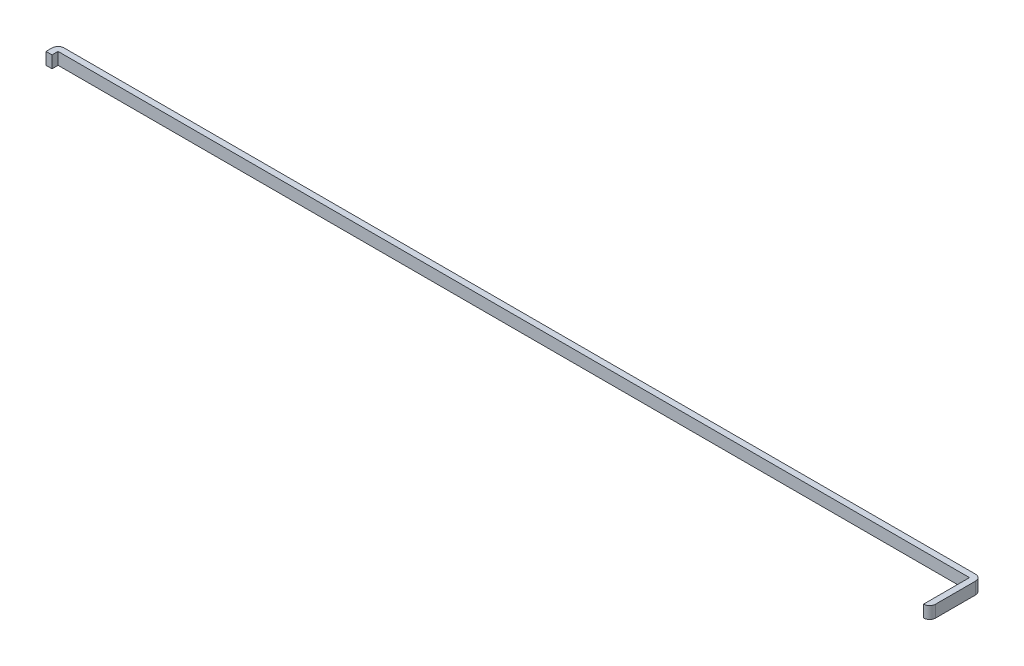
ISO-10303-21;
HEADER;
FILE_DESCRIPTION(('STEP AP214'),'2;1');
FILE_NAME('part.step','',(''),(''),'','','');
FILE_SCHEMA(('AUTOMOTIVE_DESIGN { 1 0 10303 214 1 1 1 1 }'));
ENDSEC;
DATA;
#1=APPLICATION_CONTEXT('core data for automotive mechanical design processes');
#2=APPLICATION_PROTOCOL_DEFINITION('international standard','automotive_design',2000,#1);
#3=PRODUCT_CONTEXT('',#1,'mechanical');
#4=PRODUCT('Part','Part','',(#3));
#5=PRODUCT_RELATED_PRODUCT_CATEGORY('part','',(#4));
#6=PRODUCT_DEFINITION_FORMATION('','',#4);
#7=PRODUCT_DEFINITION_CONTEXT('part definition',#1,'design');
#8=PRODUCT_DEFINITION('design','',#6,#7);
#9=PRODUCT_DEFINITION_SHAPE('','',#8);
#10=(LENGTH_UNIT() NAMED_UNIT(*) SI_UNIT(.MILLI.,.METRE.));
#11=(NAMED_UNIT(*) PLANE_ANGLE_UNIT() SI_UNIT($,.RADIAN.));
#12=(NAMED_UNIT(*) SI_UNIT($,.STERADIAN.) SOLID_ANGLE_UNIT());
#13=UNCERTAINTY_MEASURE_WITH_UNIT(LENGTH_MEASURE(1.E-05),#10,'distance_accuracy_value','');
#14=(GEOMETRIC_REPRESENTATION_CONTEXT(3) GLOBAL_UNCERTAINTY_ASSIGNED_CONTEXT((#13)) GLOBAL_UNIT_ASSIGNED_CONTEXT((#10,
#11,#12)) REPRESENTATION_CONTEXT('',''));
#15=CARTESIAN_POINT('',(0.,0.,0.));
#16=DIRECTION('',(0.,0.,1.));
#17=DIRECTION('',(1.,0.,0.));
#18=AXIS2_PLACEMENT_3D('',#15,#16,#17);
#19=CARTESIAN_POINT('',(-15.113,-2.60619,0.20019));
#20=DIRECTION('',(0.,0.,-1.));
#21=DIRECTION('',(-1.,0.,0.));
#22=AXIS2_PLACEMENT_3D('',#19,#20,#21);
#23=PLANE('',#22);
#24=DIRECTION('',(0.,1.,0.));
#25=VECTOR('',#24,1.);
#26=CARTESIAN_POINT('',(15.123,-2.60619,0.20019));
#27=LINE('',#26,#25);
#28=CARTESIAN_POINT('',(15.123,-2.60619,0.20019));
#29=VERTEX_POINT('',#28);
#30=CARTESIAN_POINT('',(15.123,-2.20581,0.20019));
#31=VERTEX_POINT('',#30);
#32=EDGE_CURVE('E125',#29,#31,#27,.T.);
#33=ORIENTED_EDGE('',*,*,#32,.T.);
#34=DIRECTION('',(1.,0.,0.));
#35=VECTOR('',#34,1.);
#36=CARTESIAN_POINT('',(15.123,-2.20581,0.20019));
#37=LINE('',#36,#35);
#38=CARTESIAN_POINT('',(-15.113,-2.20581,0.20019));
#39=VERTEX_POINT('',#38);
#40=EDGE_CURVE('E112',#31,#39,#37,.F.);
#41=ORIENTED_EDGE('',*,*,#40,.T.);
#42=DIRECTION('',(0.,1.,0.));
#43=VECTOR('',#42,1.);
#44=CARTESIAN_POINT('',(-15.113,-2.60619,0.20019));
#45=LINE('',#44,#43);
#46=CARTESIAN_POINT('',(-15.113,-2.60619,0.20019));
#47=VERTEX_POINT('',#46);
#48=EDGE_CURVE('E108',#39,#47,#45,.F.);
#49=ORIENTED_EDGE('',*,*,#48,.T.);
#50=DIRECTION('',(1.,0.,0.));
#51=VECTOR('',#50,1.);
#52=CARTESIAN_POINT('',(15.123,-2.60619,0.20019));
#53=LINE('',#52,#51);
#54=EDGE_CURVE('E126',#29,#47,#53,.F.);
#55=ORIENTED_EDGE('',*,*,#54,.F.);
#56=EDGE_LOOP('',(#33,#41,#49,#55));
#57=FACE_BOUND('',#56,.T.);
#58=ADVANCED_FACE('F17',(#57),#23,.F.);
#59=CARTESIAN_POINT('',(-15.113,-2.60619,0.40038));
#60=DIRECTION('',(-1.,0.,0.));
#61=DIRECTION('',(0.,0.,1.));
#62=AXIS2_PLACEMENT_3D('',#59,#60,#61);
#63=PLANE('',#62);
#64=ORIENTED_EDGE('',*,*,#48,.F.);
#65=DIRECTION('',(0.,0.,-1.));
#66=VECTOR('',#65,1.);
#67=CARTESIAN_POINT('',(-15.113,-2.20581,0.20019));
#68=LINE('',#67,#66);
#69=CARTESIAN_POINT('',(-15.113,-2.20581,0.40038));
#70=VERTEX_POINT('',#69);
#71=EDGE_CURVE('E120',#39,#70,#68,.F.);
#72=ORIENTED_EDGE('',*,*,#71,.T.);
#73=DIRECTION('',(0.,1.,0.));
#74=VECTOR('',#73,1.);
#75=CARTESIAN_POINT('',(-15.113,-2.60619,0.40038));
#76=LINE('',#75,#74);
#77=CARTESIAN_POINT('',(-15.113,-2.60619,0.40038));
#78=VERTEX_POINT('',#77);
#79=EDGE_CURVE('E177',#70,#78,#76,.F.);
#80=ORIENTED_EDGE('',*,*,#79,.T.);
#81=DIRECTION('',(0.,0.,-1.));
#82=VECTOR('',#81,1.);
#83=CARTESIAN_POINT('',(-15.113,-2.60619,0.20019));
#84=LINE('',#83,#82);
#85=EDGE_CURVE('E168',#47,#78,#84,.F.);
#86=ORIENTED_EDGE('',*,*,#85,.F.);
#87=EDGE_LOOP('',(#64,#72,#80,#86));
#88=FACE_BOUND('',#87,.T.);
#89=ADVANCED_FACE('F227',(#88),#63,.F.);
#90=CARTESIAN_POINT('',(-15.31319,-2.60619,0.40038));
#91=DIRECTION('',(0.,0.,-1.));
#92=DIRECTION('',(-1.,0.,0.));
#93=AXIS2_PLACEMENT_3D('',#90,#91,#92);
#94=PLANE('',#93);
#95=ORIENTED_EDGE('',*,*,#79,.F.);
#96=DIRECTION('',(1.,0.,0.));
#97=VECTOR('',#96,1.);
#98=CARTESIAN_POINT('',(15.123,-2.20581,0.40038));
#99=LINE('',#98,#97);
#100=CARTESIAN_POINT('',(-15.31319,-2.20581,0.40038));
#101=VERTEX_POINT('',#100);
#102=EDGE_CURVE('E145',#70,#101,#99,.F.);
#103=ORIENTED_EDGE('',*,*,#102,.T.);
#104=DIRECTION('',(0.,1.,0.));
#105=VECTOR('',#104,1.);
#106=CARTESIAN_POINT('',(-15.31319,-2.60619,0.40038));
#107=LINE('',#106,#105);
#108=CARTESIAN_POINT('',(-15.31319,-2.60619,0.40038));
#109=VERTEX_POINT('',#108);
#110=EDGE_CURVE('E184',#101,#109,#107,.F.);
#111=ORIENTED_EDGE('',*,*,#110,.T.);
#112=DIRECTION('',(1.,0.,0.));
#113=VECTOR('',#112,1.);
#114=CARTESIAN_POINT('',(15.123,-2.60619,0.40038));
#115=LINE('',#114,#113);
#116=EDGE_CURVE('E86',#78,#109,#115,.F.);
#117=ORIENTED_EDGE('',*,*,#116,.F.);
#118=EDGE_LOOP('',(#95,#103,#111,#117));
#119=FACE_BOUND('',#118,.T.);
#120=ADVANCED_FACE('F226',(#119),#94,.F.);
#121=CARTESIAN_POINT('',(-15.31319,-2.60619,0.20019));
#122=DIRECTION('',(1.,0.,0.));
#123=DIRECTION('',(0.,0.,-1.));
#124=AXIS2_PLACEMENT_3D('',#121,#122,#123);
#125=PLANE('',#124);
#126=ORIENTED_EDGE('',*,*,#110,.F.);
#127=DIRECTION('',(0.,0.,-1.));
#128=VECTOR('',#127,1.);
#129=CARTESIAN_POINT('',(-15.31319,-2.20581,0.20019));
#130=LINE('',#129,#128);
#131=CARTESIAN_POINT('',(-15.31319,-2.20581,0.20019));
#132=VERTEX_POINT('',#131);
#133=EDGE_CURVE('E148',#101,#132,#130,.T.);
#134=ORIENTED_EDGE('',*,*,#133,.T.);
#135=DIRECTION('',(0.,-1.,0.));
#136=VECTOR('',#135,1.);
#137=CARTESIAN_POINT('',(-15.31319,-2.60619,0.20019));
#138=LINE('',#137,#136);
#139=CARTESIAN_POINT('',(-15.31319,-2.60619,0.20019));
#140=VERTEX_POINT('',#139);
#141=EDGE_CURVE('E134',#140,#132,#138,.F.);
#142=ORIENTED_EDGE('',*,*,#141,.F.);
#143=DIRECTION('',(0.,0.,-1.));
#144=VECTOR('',#143,1.);
#145=CARTESIAN_POINT('',(-15.31319,-2.60619,0.20019));
#146=LINE('',#145,#144);
#147=EDGE_CURVE('E80',#109,#140,#146,.T.);
#148=ORIENTED_EDGE('',*,*,#147,.F.);
#149=EDGE_LOOP('',(#126,#134,#142,#148));
#150=FACE_BOUND('',#149,.T.);
#151=ADVANCED_FACE('F224',(#150),#125,.F.);
#152=CARTESIAN_POINT('',(15.32319,-2.60619,1.524905));
#153=DIRECTION('',(-1.,0.,0.));
#154=DIRECTION('',(0.,0.,1.));
#155=AXIS2_PLACEMENT_3D('',#152,#153,#154);
#156=PLANE('',#155);
#157=DIRECTION('',(0.,-1.,0.));
#158=VECTOR('',#157,1.);
#159=CARTESIAN_POINT('',(15.32319,-2.60619,0.20019));
#160=LINE('',#159,#158);
#161=CARTESIAN_POINT('',(15.32319,-2.20581,0.20019));
#162=VERTEX_POINT('',#161);
#163=CARTESIAN_POINT('',(15.32319,-2.60619,0.20019));
#164=VERTEX_POINT('',#163);
#165=EDGE_CURVE('E74',#162,#164,#160,.T.);
#166=ORIENTED_EDGE('',*,*,#165,.F.);
#167=DIRECTION('',(0.,0.,-1.));
#168=VECTOR('',#167,1.);
#169=CARTESIAN_POINT('',(15.32319,-2.20581,0.20019));
#170=LINE('',#169,#168);
#171=CARTESIAN_POINT('',(15.32319,-2.20581,1.524905));
#172=VERTEX_POINT('',#171);
#173=EDGE_CURVE('E139',#162,#172,#170,.F.);
#174=ORIENTED_EDGE('',*,*,#173,.T.);
#175=DIRECTION('',(0.,-1.,0.));
#176=VECTOR('',#175,1.);
#177=CARTESIAN_POINT('',(15.32319,-2.60619,1.524905));
#178=LINE('',#177,#176);
#179=CARTESIAN_POINT('',(15.32319,-2.60619,1.524905));
#180=VERTEX_POINT('',#179);
#181=EDGE_CURVE('E190',#180,#172,#178,.F.);
#182=ORIENTED_EDGE('',*,*,#181,.F.);
#183=DIRECTION('',(0.,0.,-1.));
#184=VECTOR('',#183,1.);
#185=CARTESIAN_POINT('',(15.32319,-2.60619,0.20019));
#186=LINE('',#185,#184);
#187=EDGE_CURVE('E160',#164,#180,#186,.F.);
#188=ORIENTED_EDGE('',*,*,#187,.F.);
#189=EDGE_LOOP('',(#166,#174,#182,#188));
#190=FACE_BOUND('',#189,.T.);
#191=ADVANCED_FACE('F216',(#190),#156,.F.);
#192=CARTESIAN_POINT('',(15.123,-2.60619,1.524905));
#193=DIRECTION('',(0.,-1.,0.));
#194=DIRECTION('',(0.,0.,-1.));
#195=AXIS2_PLACEMENT_3D('',#192,#193,#194);
#196=CYLINDRICAL_SURFACE('',#195,0.20019);
#197=CARTESIAN_POINT('',(15.123,-2.20581,1.524905));
#198=DIRECTION('',(0.,-1.,0.));
#199=DIRECTION('',(0.,0.,-1.));
#200=AXIS2_PLACEMENT_3D('',#197,#198,#199);
#201=CIRCLE('',#200,0.20019);
#202=CARTESIAN_POINT('',(15.123,-2.20581,1.725095));
#203=VERTEX_POINT('',#202);
#204=EDGE_CURVE('E135',#172,#203,#201,.T.);
#205=ORIENTED_EDGE('',*,*,#204,.T.);
#206=DIRECTION('',(0.,1.,0.));
#207=VECTOR('',#206,1.);
#208=CARTESIAN_POINT('',(15.123,-2.60619,1.725095));
#209=LINE('',#208,#207);
#210=CARTESIAN_POINT('',(15.123,-2.60619,1.725095));
#211=VERTEX_POINT('',#210);
#212=EDGE_CURVE('E129',#203,#211,#209,.F.);
#213=ORIENTED_EDGE('',*,*,#212,.T.);
#214=CARTESIAN_POINT('',(15.123,-2.60619,1.524905));
#215=DIRECTION('',(0.,-1.,0.));
#216=DIRECTION('',(0.,0.,-1.));
#217=AXIS2_PLACEMENT_3D('',#214,#215,#216);
#218=CIRCLE('',#217,0.20019);
#219=EDGE_CURVE('E156',#180,#211,#218,.T.);
#220=ORIENTED_EDGE('',*,*,#219,.F.);
#221=ORIENTED_EDGE('',*,*,#181,.T.);
#222=EDGE_LOOP('',(#205,#213,#220,#221));
#223=FACE_BOUND('',#222,.T.);
#224=ADVANCED_FACE('F218',(#223),#196,.T.);
#225=CARTESIAN_POINT('',(15.123,-2.60619,0.20019));
#226=DIRECTION('',(1.,0.,0.));
#227=DIRECTION('',(0.,0.,-1.));
#228=AXIS2_PLACEMENT_3D('',#225,#226,#227);
#229=PLANE('',#228);
#230=DIRECTION('',(0.,0.,-1.));
#231=VECTOR('',#230,1.);
#232=CARTESIAN_POINT('',(15.123,-2.60619,0.20019));
#233=LINE('',#232,#231);
#234=EDGE_CURVE('E159',#211,#29,#233,.T.);
#235=ORIENTED_EDGE('',*,*,#234,.F.);
#236=ORIENTED_EDGE('',*,*,#212,.F.);
#237=DIRECTION('',(0.,0.,-1.));
#238=VECTOR('',#237,1.);
#239=CARTESIAN_POINT('',(15.123,-2.20581,0.20019));
#240=LINE('',#239,#238);
#241=EDGE_CURVE('E117',#203,#31,#240,.T.);
#242=ORIENTED_EDGE('',*,*,#241,.T.);
#243=ORIENTED_EDGE('',*,*,#32,.F.);
#244=EDGE_LOOP('',(#235,#236,#242,#243));
#245=FACE_BOUND('',#244,.T.);
#246=ADVANCED_FACE('F131',(#245),#229,.F.);
#247=CARTESIAN_POINT('',(15.123,-2.60619,0.20019));
#248=DIRECTION('',(0.,-1.,0.));
#249=DIRECTION('',(0.,0.,-1.));
#250=AXIS2_PLACEMENT_3D('',#247,#248,#249);
#251=CYLINDRICAL_SURFACE('',#250,0.20019);
#252=CARTESIAN_POINT('',(15.123,-2.20581,0.20019));
#253=DIRECTION('',(0.,-1.,0.));
#254=DIRECTION('',(0.,0.,-1.));
#255=AXIS2_PLACEMENT_3D('',#252,#253,#254);
#256=CIRCLE('',#255,0.20019);
#257=CARTESIAN_POINT('',(15.123,-2.20581,0.));
#258=VERTEX_POINT('',#257);
#259=EDGE_CURVE('E20',#258,#162,#256,.T.);
#260=ORIENTED_EDGE('',*,*,#259,.T.);
#261=ORIENTED_EDGE('',*,*,#165,.T.);
#262=CARTESIAN_POINT('',(15.123,-2.60619,0.20019));
#263=DIRECTION('',(0.,-1.,0.));
#264=DIRECTION('',(0.,0.,-1.));
#265=AXIS2_PLACEMENT_3D('',#262,#263,#264);
#266=CIRCLE('',#265,0.20019);
#267=CARTESIAN_POINT('',(15.123,-2.60619,0.));
#268=VERTEX_POINT('',#267);
#269=EDGE_CURVE('E161',#268,#164,#266,.T.);
#270=ORIENTED_EDGE('',*,*,#269,.F.);
#271=DIRECTION('',(0.,1.,0.));
#272=VECTOR('',#271,1.);
#273=CARTESIAN_POINT('',(15.123,-2.60619,0.));
#274=LINE('',#273,#272);
#275=EDGE_CURVE('E64',#268,#258,#274,.T.);
#276=ORIENTED_EDGE('',*,*,#275,.T.);
#277=EDGE_LOOP('',(#260,#261,#270,#276));
#278=FACE_BOUND('',#277,.T.);
#279=ADVANCED_FACE('F219',(#278),#251,.T.);
#280=CARTESIAN_POINT('',(15.123,-2.20581,0.20019));
#281=DIRECTION('',(0.,-1.,0.));
#282=DIRECTION('',(0.,0.,-1.));
#283=AXIS2_PLACEMENT_3D('',#280,#281,#282);
#284=PLANE('',#283);
#285=ORIENTED_EDGE('',*,*,#241,.F.);
#286=ORIENTED_EDGE('',*,*,#204,.F.);
#287=ORIENTED_EDGE('',*,*,#173,.F.);
#288=ORIENTED_EDGE('',*,*,#259,.F.);
#289=DIRECTION('',(1.,0.,0.));
#290=VECTOR('',#289,1.);
#291=CARTESIAN_POINT('',(15.123,-2.20581,0.));
#292=LINE('',#291,#290);
#293=CARTESIAN_POINT('',(-15.113,-2.20581,0.));
#294=VERTEX_POINT('',#293);
#295=EDGE_CURVE('E204',#258,#294,#292,.F.);
#296=ORIENTED_EDGE('',*,*,#295,.T.);
#297=CARTESIAN_POINT('',(-15.113,-2.20581,0.20019));
#298=DIRECTION('',(0.,-1.,0.));
#299=DIRECTION('',(0.,0.,-1.));
#300=AXIS2_PLACEMENT_3D('',#297,#298,#299);
#301=CIRCLE('',#300,0.20019);
#302=EDGE_CURVE('E137',#132,#294,#301,.T.);
#303=ORIENTED_EDGE('',*,*,#302,.F.);
#304=ORIENTED_EDGE('',*,*,#133,.F.);
#305=ORIENTED_EDGE('',*,*,#102,.F.);
#306=ORIENTED_EDGE('',*,*,#71,.F.);
#307=ORIENTED_EDGE('',*,*,#40,.F.);
#308=EDGE_LOOP('',(#285,#286,#287,#288,#296,#303,#304,#305,#306,#307));
#309=FACE_BOUND('',#308,.T.);
#310=ADVANCED_FACE('F114',(#309),#284,.F.);
#311=CARTESIAN_POINT('',(-15.113,-2.60619,0.20019));
#312=DIRECTION('',(0.,-1.,0.));
#313=DIRECTION('',(0.,0.,-1.));
#314=AXIS2_PLACEMENT_3D('',#311,#312,#313);
#315=CYLINDRICAL_SURFACE('',#314,0.20019);
#316=ORIENTED_EDGE('',*,*,#302,.T.);
#317=DIRECTION('',(0.,1.,0.));
#318=VECTOR('',#317,1.);
#319=CARTESIAN_POINT('',(-15.113,-2.60619,0.));
#320=LINE('',#319,#318);
#321=CARTESIAN_POINT('',(-15.113,-2.60619,0.));
#322=VERTEX_POINT('',#321);
#323=EDGE_CURVE('E26',#294,#322,#320,.F.);
#324=ORIENTED_EDGE('',*,*,#323,.T.);
#325=CARTESIAN_POINT('',(-15.113,-2.60619,0.20019));
#326=DIRECTION('',(0.,-1.,0.));
#327=DIRECTION('',(0.,0.,-1.));
#328=AXIS2_PLACEMENT_3D('',#325,#326,#327);
#329=CIRCLE('',#328,0.20019);
#330=EDGE_CURVE('E34',#140,#322,#329,.T.);
#331=ORIENTED_EDGE('',*,*,#330,.F.);
#332=ORIENTED_EDGE('',*,*,#141,.T.);
#333=EDGE_LOOP('',(#316,#324,#331,#332));
#334=FACE_BOUND('',#333,.T.);
#335=ADVANCED_FACE('F221',(#334),#315,.T.);
#336=CARTESIAN_POINT('',(15.123,-2.60619,0.20019));
#337=DIRECTION('',(0.,-1.,0.));
#338=DIRECTION('',(0.,0.,-1.));
#339=AXIS2_PLACEMENT_3D('',#336,#337,#338);
#340=PLANE('',#339);
#341=ORIENTED_EDGE('',*,*,#219,.T.);
#342=ORIENTED_EDGE('',*,*,#234,.T.);
#343=ORIENTED_EDGE('',*,*,#54,.T.);
#344=ORIENTED_EDGE('',*,*,#85,.T.);
#345=ORIENTED_EDGE('',*,*,#116,.T.);
#346=ORIENTED_EDGE('',*,*,#147,.T.);
#347=ORIENTED_EDGE('',*,*,#330,.T.);
#348=DIRECTION('',(1.,0.,0.));
#349=VECTOR('',#348,1.);
#350=CARTESIAN_POINT('',(15.123,-2.60619,0.));
#351=LINE('',#350,#349);
#352=EDGE_CURVE('E11',#322,#268,#351,.T.);
#353=ORIENTED_EDGE('',*,*,#352,.T.);
#354=ORIENTED_EDGE('',*,*,#269,.T.);
#355=ORIENTED_EDGE('',*,*,#187,.T.);
#356=EDGE_LOOP('',(#341,#342,#343,#344,#345,#346,#347,#353,#354,#355));
#357=FACE_BOUND('',#356,.T.);
#358=ADVANCED_FACE('F213',(#357),#340,.T.);
#359=CARTESIAN_POINT('',(15.123,-2.60619,0.));
#360=DIRECTION('',(0.,0.,1.));
#361=DIRECTION('',(1.,0.,0.));
#362=AXIS2_PLACEMENT_3D('',#359,#360,#361);
#363=PLANE('',#362);
#364=ORIENTED_EDGE('',*,*,#323,.F.);
#365=ORIENTED_EDGE('',*,*,#295,.F.);
#366=ORIENTED_EDGE('',*,*,#275,.F.);
#367=ORIENTED_EDGE('',*,*,#352,.F.);
#368=EDGE_LOOP('',(#364,#365,#366,#367));
#369=FACE_BOUND('',#368,.T.);
#370=ADVANCED_FACE('F220',(#369),#363,.F.);
#371=CLOSED_SHELL('',(#58,#89,#120,#151,#191,#224,#246,#279,#310,#335,#358,#370));
#372=MANIFOLD_SOLID_BREP('B1',#371);
#373=ADVANCED_BREP_SHAPE_REPRESENTATION('',(#18,#372),#14);
#374=SHAPE_DEFINITION_REPRESENTATION(#9,#373);
ENDSEC;
END-ISO-10303-21;
